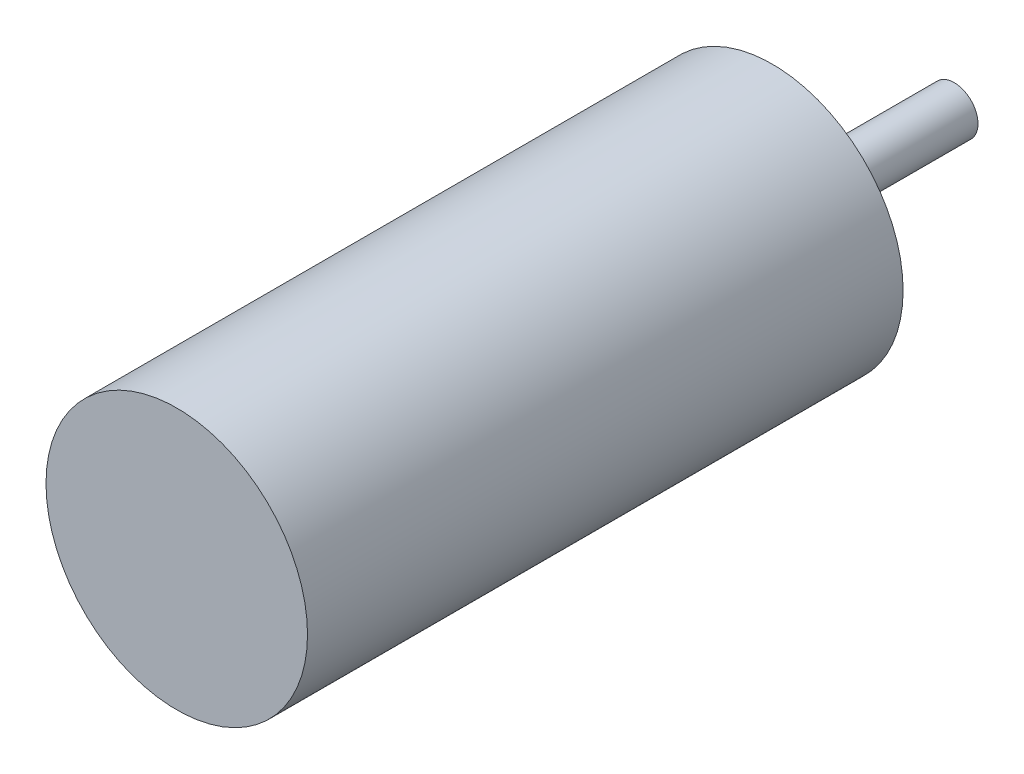
ISO-10303-21;
HEADER;
FILE_DESCRIPTION(('STEP AP214'),'2;1');
FILE_NAME('part.step','',(''),(''),'','','');
FILE_SCHEMA(('AUTOMOTIVE_DESIGN { 1 0 10303 214 1 1 1 1 }'));
ENDSEC;
DATA;
#1=APPLICATION_CONTEXT('core data for automotive mechanical design processes');
#2=APPLICATION_PROTOCOL_DEFINITION('international standard','automotive_design',2000,#1);
#3=PRODUCT_CONTEXT('',#1,'mechanical');
#4=PRODUCT('Part','Part','',(#3));
#5=PRODUCT_RELATED_PRODUCT_CATEGORY('part','',(#4));
#6=PRODUCT_DEFINITION_FORMATION('','',#4);
#7=PRODUCT_DEFINITION_CONTEXT('part definition',#1,'design');
#8=PRODUCT_DEFINITION('design','',#6,#7);
#9=PRODUCT_DEFINITION_SHAPE('','',#8);
#10=(LENGTH_UNIT() NAMED_UNIT(*) SI_UNIT(.MILLI.,.METRE.));
#11=(NAMED_UNIT(*) PLANE_ANGLE_UNIT() SI_UNIT($,.RADIAN.));
#12=(NAMED_UNIT(*) SI_UNIT($,.STERADIAN.) SOLID_ANGLE_UNIT());
#13=UNCERTAINTY_MEASURE_WITH_UNIT(LENGTH_MEASURE(1.E-05),#10,'distance_accuracy_value','');
#14=(GEOMETRIC_REPRESENTATION_CONTEXT(3) GLOBAL_UNCERTAINTY_ASSIGNED_CONTEXT((#13)) GLOBAL_UNIT_ASSIGNED_CONTEXT((#10,
#11,#12)) REPRESENTATION_CONTEXT('',''));
#15=CARTESIAN_POINT('',(0.,0.,0.));
#16=DIRECTION('',(0.,0.,1.));
#17=DIRECTION('',(1.,0.,0.));
#18=AXIS2_PLACEMENT_3D('',#15,#16,#17);
#19=CARTESIAN_POINT('',(0.,0.,50.1));
#20=DIRECTION('',(0.,0.,-1.));
#21=DIRECTION('',(-1.,0.,0.));
#22=AXIS2_PLACEMENT_3D('',#19,#20,#21);
#23=CYLINDRICAL_SURFACE('',#22,11.);
#24=CARTESIAN_POINT('',(0.,0.,50.1));
#25=DIRECTION('',(0.,0.,1.));
#26=DIRECTION('',(1.,0.,0.));
#27=AXIS2_PLACEMENT_3D('',#24,#25,#26);
#28=CIRCLE('',#27,11.);
#29=CARTESIAN_POINT('',(11.,0.,50.1));
#30=VERTEX_POINT('',#29);
#31=EDGE_CURVE('E10',#30,#30,#28,.T.);
#32=ORIENTED_EDGE('',*,*,#31,.F.);
#33=EDGE_LOOP('',(#32));
#34=FACE_BOUND('',#33,.T.);
#35=CARTESIAN_POINT('',(0.,0.,0.));
#36=DIRECTION('',(0.,0.,1.));
#37=DIRECTION('',(1.,0.,0.));
#38=AXIS2_PLACEMENT_3D('',#35,#36,#37);
#39=CIRCLE('',#38,11.);
#40=CARTESIAN_POINT('',(11.,0.,0.));
#41=VERTEX_POINT('',#40);
#42=EDGE_CURVE('E35',#41,#41,#39,.T.);
#43=ORIENTED_EDGE('',*,*,#42,.T.);
#44=EDGE_LOOP('',(#43));
#45=FACE_BOUND('',#44,.T.);
#46=ADVANCED_FACE('F32',(#34,#45),#23,.T.);
#47=CARTESIAN_POINT('',(0.,0.,50.1));
#48=DIRECTION('',(0.,0.,1.));
#49=DIRECTION('',(1.,0.,0.));
#50=AXIS2_PLACEMENT_3D('',#47,#48,#49);
#51=PLANE('',#50);
#52=ORIENTED_EDGE('',*,*,#31,.T.);
#53=EDGE_LOOP('',(#52));
#54=FACE_BOUND('',#53,.T.);
#55=ADVANCED_FACE('F62',(#54),#51,.T.);
#56=CARTESIAN_POINT('',(0.,0.,0.));
#57=DIRECTION('',(0.,0.,1.));
#58=DIRECTION('',(1.,0.,0.));
#59=AXIS2_PLACEMENT_3D('',#56,#57,#58);
#60=PLANE('',#59);
#61=CARTESIAN_POINT('',(0.,0.,0.));
#62=DIRECTION('',(0.,0.,1.));
#63=DIRECTION('',(1.,0.,0.));
#64=AXIS2_PLACEMENT_3D('',#61,#62,#63);
#65=CIRCLE('',#64,2.);
#66=CARTESIAN_POINT('',(2.,0.,0.));
#67=VERTEX_POINT('',#66);
#68=EDGE_CURVE('E44',#67,#67,#65,.T.);
#69=ORIENTED_EDGE('',*,*,#68,.T.);
#70=EDGE_LOOP('',(#69));
#71=FACE_BOUND('',#70,.T.);
#72=ORIENTED_EDGE('',*,*,#42,.F.);
#73=EDGE_LOOP('',(#72));
#74=FACE_BOUND('',#73,.T.);
#75=ADVANCED_FACE('F59',(#71,#74),#60,.F.);
#76=CARTESIAN_POINT('',(0.,0.,-15.3));
#77=DIRECTION('',(0.,0.,1.));
#78=DIRECTION('',(1.,0.,0.));
#79=AXIS2_PLACEMENT_3D('',#76,#77,#78);
#80=CYLINDRICAL_SURFACE('',#79,2.);
#81=CARTESIAN_POINT('',(0.,0.,-15.3));
#82=DIRECTION('',(0.,0.,1.));
#83=DIRECTION('',(1.,0.,0.));
#84=AXIS2_PLACEMENT_3D('',#81,#82,#83);
#85=CIRCLE('',#84,2.);
#86=CARTESIAN_POINT('',(2.,0.,-15.3));
#87=VERTEX_POINT('',#86);
#88=EDGE_CURVE('E42',#87,#87,#85,.T.);
#89=ORIENTED_EDGE('',*,*,#88,.T.);
#90=EDGE_LOOP('',(#89));
#91=FACE_BOUND('',#90,.T.);
#92=ORIENTED_EDGE('',*,*,#68,.F.);
#93=EDGE_LOOP('',(#92));
#94=FACE_BOUND('',#93,.T.);
#95=ADVANCED_FACE('F50',(#91,#94),#80,.T.);
#96=CARTESIAN_POINT('',(0.,0.,-15.3));
#97=DIRECTION('',(0.,0.,1.));
#98=DIRECTION('',(1.,0.,0.));
#99=AXIS2_PLACEMENT_3D('',#96,#97,#98);
#100=PLANE('',#99);
#101=ORIENTED_EDGE('',*,*,#88,.F.);
#102=EDGE_LOOP('',(#101));
#103=FACE_BOUND('',#102,.T.);
#104=ADVANCED_FACE('F53',(#103),#100,.F.);
#105=CLOSED_SHELL('',(#46,#55,#75,#95,#104));
#106=MANIFOLD_SOLID_BREP('B2',#105);
#107=ADVANCED_BREP_SHAPE_REPRESENTATION('',(#18,#106),#14);
#108=SHAPE_DEFINITION_REPRESENTATION(#9,#107);
ENDSEC;
END-ISO-10303-21;
